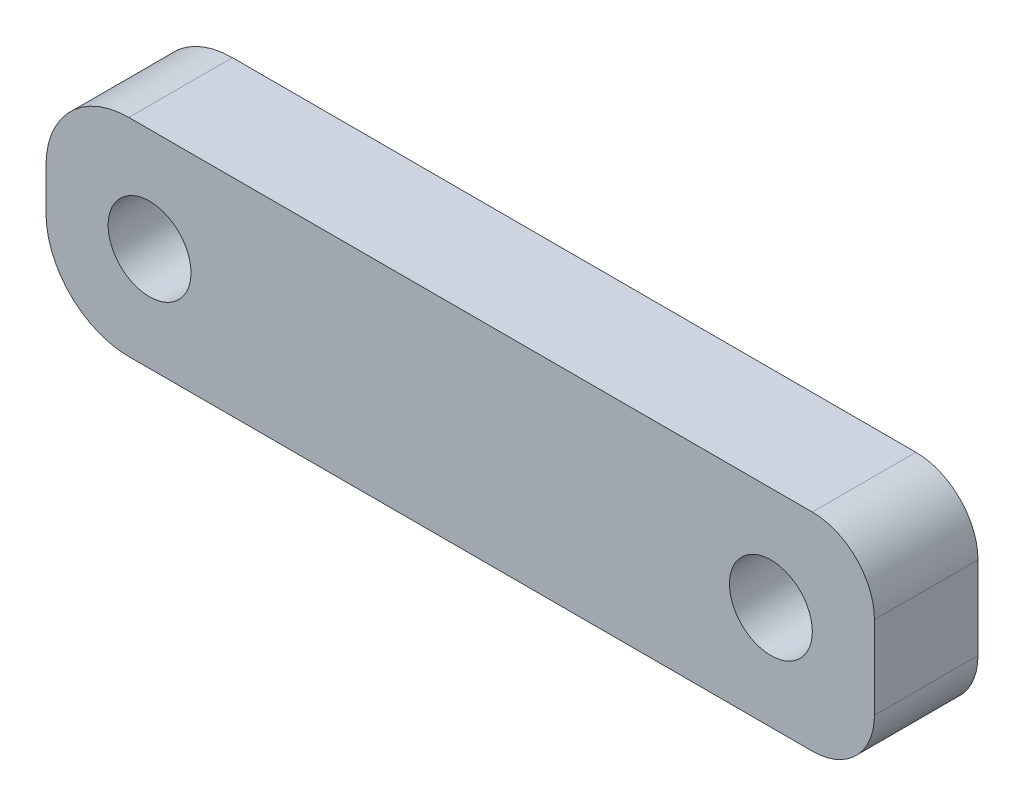
ISO-10303-21;
HEADER;
FILE_DESCRIPTION(('STEP AP214'),'2;1');
FILE_NAME('part.step','',(''),(''),'','','');
FILE_SCHEMA(('AUTOMOTIVE_DESIGN { 1 0 10303 214 1 1 1 1 }'));
ENDSEC;
DATA;
#1=APPLICATION_CONTEXT('core data for automotive mechanical design processes');
#2=APPLICATION_PROTOCOL_DEFINITION('international standard','automotive_design',2000,#1);
#3=PRODUCT_CONTEXT('',#1,'mechanical');
#4=PRODUCT('Part','Part','',(#3));
#5=PRODUCT_RELATED_PRODUCT_CATEGORY('part','',(#4));
#6=PRODUCT_DEFINITION_FORMATION('','',#4);
#7=PRODUCT_DEFINITION_CONTEXT('part definition',#1,'design');
#8=PRODUCT_DEFINITION('design','',#6,#7);
#9=PRODUCT_DEFINITION_SHAPE('','',#8);
#10=(LENGTH_UNIT() NAMED_UNIT(*) SI_UNIT(.MILLI.,.METRE.));
#11=(NAMED_UNIT(*) PLANE_ANGLE_UNIT() SI_UNIT($,.RADIAN.));
#12=(NAMED_UNIT(*) SI_UNIT($,.STERADIAN.) SOLID_ANGLE_UNIT());
#13=UNCERTAINTY_MEASURE_WITH_UNIT(LENGTH_MEASURE(1.E-05),#10,'distance_accuracy_value','');
#14=(GEOMETRIC_REPRESENTATION_CONTEXT(3) GLOBAL_UNCERTAINTY_ASSIGNED_CONTEXT((#13)) GLOBAL_UNIT_ASSIGNED_CONTEXT((#10,
#11,#12)) REPRESENTATION_CONTEXT('',''));
#15=CARTESIAN_POINT('',(0.,0.,0.));
#16=DIRECTION('',(0.,0.,1.));
#17=DIRECTION('',(1.,0.,0.));
#18=AXIS2_PLACEMENT_3D('',#15,#16,#17);
#19=CARTESIAN_POINT('',(37.,-7.,5.));
#20=DIRECTION('',(0.,0.,1.));
#21=DIRECTION('',(1.,0.,0.));
#22=AXIS2_PLACEMENT_3D('',#19,#20,#21);
#23=PLANE('',#22);
#24=CARTESIAN_POINT('',(35.,-5.,5.));
#25=DIRECTION('',(0.,0.,1.));
#26=DIRECTION('',(1.,0.,0.));
#27=AXIS2_PLACEMENT_3D('',#24,#25,#26);
#28=CIRCLE('',#27,2.);
#29=CARTESIAN_POINT('',(37.,-5.,5.));
#30=VERTEX_POINT('',#29);
#31=EDGE_CURVE('E142',#30,#30,#28,.T.);
#32=ORIENTED_EDGE('',*,*,#31,.F.);
#33=EDGE_LOOP('',(#32));
#34=FACE_BOUND('',#33,.T.);
#35=CARTESIAN_POINT('',(37.,-7.,5.));
#36=DIRECTION('',(0.,0.,1.));
#37=DIRECTION('',(1.,0.,0.));
#38=AXIS2_PLACEMENT_3D('',#35,#36,#37);
#39=CIRCLE('',#38,3.);
#40=CARTESIAN_POINT('',(37.,-10.,5.));
#41=VERTEX_POINT('',#40);
#42=CARTESIAN_POINT('',(40.,-6.99999999999998,5.));
#43=VERTEX_POINT('',#42);
#44=EDGE_CURVE('E153',#41,#43,#39,.T.);
#45=ORIENTED_EDGE('',*,*,#44,.T.);
#46=DIRECTION('',(0.,1.,0.));
#47=VECTOR('',#46,1.);
#48=CARTESIAN_POINT('',(40.,-3.00000000000002,5.));
#49=LINE('',#48,#47);
#50=CARTESIAN_POINT('',(40.,-3.00000000000002,5.));
#51=VERTEX_POINT('',#50);
#52=EDGE_CURVE('E101',#43,#51,#49,.T.);
#53=ORIENTED_EDGE('',*,*,#52,.T.);
#54=CARTESIAN_POINT('',(37.,-3.,5.));
#55=DIRECTION('',(0.,0.,1.));
#56=DIRECTION('',(-1.,0.,0.));
#57=AXIS2_PLACEMENT_3D('',#54,#55,#56);
#58=CIRCLE('',#57,3.);
#59=CARTESIAN_POINT('',(37.,0.,5.));
#60=VERTEX_POINT('',#59);
#61=EDGE_CURVE('E168',#51,#60,#58,.T.);
#62=ORIENTED_EDGE('',*,*,#61,.T.);
#63=DIRECTION('',(-1.,0.,0.));
#64=VECTOR('',#63,1.);
#65=CARTESIAN_POINT('',(4.00000000000003,0.,5.));
#66=LINE('',#65,#64);
#67=CARTESIAN_POINT('',(4.00000000000003,0.,5.));
#68=VERTEX_POINT('',#67);
#69=EDGE_CURVE('E181',#60,#68,#66,.T.);
#70=ORIENTED_EDGE('',*,*,#69,.T.);
#71=CARTESIAN_POINT('',(4.,-4.,5.));
#72=DIRECTION('',(0.,0.,1.));
#73=DIRECTION('',(1.,0.,0.));
#74=AXIS2_PLACEMENT_3D('',#71,#72,#73);
#75=CIRCLE('',#74,4.);
#76=CARTESIAN_POINT('',(0.,-4.00000000000003,5.));
#77=VERTEX_POINT('',#76);
#78=EDGE_CURVE('E120',#68,#77,#75,.T.);
#79=ORIENTED_EDGE('',*,*,#78,.T.);
#80=DIRECTION('',(0.,-1.,0.));
#81=VECTOR('',#80,1.);
#82=CARTESIAN_POINT('',(0.,-4.00000000000003,5.));
#83=LINE('',#82,#81);
#84=CARTESIAN_POINT('',(0.,-5.99999999999997,5.));
#85=VERTEX_POINT('',#84);
#86=EDGE_CURVE('E114',#77,#85,#83,.T.);
#87=ORIENTED_EDGE('',*,*,#86,.T.);
#88=CARTESIAN_POINT('',(4.,-6.,5.));
#89=DIRECTION('',(0.,0.,1.));
#90=DIRECTION('',(1.,0.,0.));
#91=AXIS2_PLACEMENT_3D('',#88,#89,#90);
#92=CIRCLE('',#91,4.);
#93=CARTESIAN_POINT('',(4.00000000000003,-10.,5.));
#94=VERTEX_POINT('',#93);
#95=EDGE_CURVE('E118',#85,#94,#92,.T.);
#96=ORIENTED_EDGE('',*,*,#95,.T.);
#97=DIRECTION('',(1.,0.,0.));
#98=VECTOR('',#97,1.);
#99=CARTESIAN_POINT('',(4.00000000000003,-10.,5.));
#100=LINE('',#99,#98);
#101=EDGE_CURVE('E58',#94,#41,#100,.T.);
#102=ORIENTED_EDGE('',*,*,#101,.T.);
#103=EDGE_LOOP('',(#45,#53,#62,#70,#79,#87,#96,#102));
#104=FACE_BOUND('',#103,.T.);
#105=CARTESIAN_POINT('',(5.,-5.,5.));
#106=DIRECTION('',(0.,0.,1.));
#107=DIRECTION('',(1.,0.,0.));
#108=AXIS2_PLACEMENT_3D('',#105,#106,#107);
#109=CIRCLE('',#108,2.);
#110=CARTESIAN_POINT('',(7.,-5.,5.));
#111=VERTEX_POINT('',#110);
#112=EDGE_CURVE('E190',#111,#111,#109,.T.);
#113=ORIENTED_EDGE('',*,*,#112,.F.);
#114=EDGE_LOOP('',(#113));
#115=FACE_BOUND('',#114,.T.);
#116=ADVANCED_FACE('F41',(#34,#104,#115),#23,.T.);
#117=CARTESIAN_POINT('',(37.,-7.,0.));
#118=DIRECTION('',(0.,0.,1.));
#119=DIRECTION('',(1.,0.,0.));
#120=AXIS2_PLACEMENT_3D('',#117,#118,#119);
#121=PLANE('',#120);
#122=CARTESIAN_POINT('',(37.,-7.,0.));
#123=DIRECTION('',(0.,0.,1.));
#124=DIRECTION('',(1.,0.,0.));
#125=AXIS2_PLACEMENT_3D('',#122,#123,#124);
#126=CIRCLE('',#125,3.);
#127=CARTESIAN_POINT('',(37.,-10.,0.));
#128=VERTEX_POINT('',#127);
#129=CARTESIAN_POINT('',(40.,-6.99999999999998,0.));
#130=VERTEX_POINT('',#129);
#131=EDGE_CURVE('E138',#128,#130,#126,.T.);
#132=ORIENTED_EDGE('',*,*,#131,.F.);
#133=DIRECTION('',(1.,0.,0.));
#134=VECTOR('',#133,1.);
#135=CARTESIAN_POINT('',(4.00000000000003,-10.,0.));
#136=LINE('',#135,#134);
#137=CARTESIAN_POINT('',(4.00000000000003,-10.,0.));
#138=VERTEX_POINT('',#137);
#139=EDGE_CURVE('E93',#138,#128,#136,.T.);
#140=ORIENTED_EDGE('',*,*,#139,.F.);
#141=CARTESIAN_POINT('',(4.,-6.,0.));
#142=DIRECTION('',(0.,0.,1.));
#143=DIRECTION('',(1.,0.,0.));
#144=AXIS2_PLACEMENT_3D('',#141,#142,#143);
#145=CIRCLE('',#144,4.);
#146=CARTESIAN_POINT('',(0.,-5.99999999999997,0.));
#147=VERTEX_POINT('',#146);
#148=EDGE_CURVE('E87',#147,#138,#145,.T.);
#149=ORIENTED_EDGE('',*,*,#148,.F.);
#150=DIRECTION('',(0.,-1.,0.));
#151=VECTOR('',#150,1.);
#152=CARTESIAN_POINT('',(0.,-4.00000000000003,0.));
#153=LINE('',#152,#151);
#154=CARTESIAN_POINT('',(0.,-4.00000000000003,0.));
#155=VERTEX_POINT('',#154);
#156=EDGE_CURVE('E128',#155,#147,#153,.T.);
#157=ORIENTED_EDGE('',*,*,#156,.F.);
#158=CARTESIAN_POINT('',(4.,-4.,0.));
#159=DIRECTION('',(0.,0.,1.));
#160=DIRECTION('',(1.,0.,0.));
#161=AXIS2_PLACEMENT_3D('',#158,#159,#160);
#162=CIRCLE('',#161,4.);
#163=CARTESIAN_POINT('',(4.00000000000003,0.,0.));
#164=VERTEX_POINT('',#163);
#165=EDGE_CURVE('E148',#164,#155,#162,.T.);
#166=ORIENTED_EDGE('',*,*,#165,.F.);
#167=DIRECTION('',(-1.,0.,0.));
#168=VECTOR('',#167,1.);
#169=CARTESIAN_POINT('',(4.00000000000003,0.,0.));
#170=LINE('',#169,#168);
#171=CARTESIAN_POINT('',(37.,0.,0.));
#172=VERTEX_POINT('',#171);
#173=EDGE_CURVE('E146',#172,#164,#170,.T.);
#174=ORIENTED_EDGE('',*,*,#173,.F.);
#175=CARTESIAN_POINT('',(37.,-3.,0.));
#176=DIRECTION('',(0.,0.,1.));
#177=DIRECTION('',(-1.,0.,0.));
#178=AXIS2_PLACEMENT_3D('',#175,#176,#177);
#179=CIRCLE('',#178,3.);
#180=CARTESIAN_POINT('',(40.,-3.00000000000002,0.));
#181=VERTEX_POINT('',#180);
#182=EDGE_CURVE('E144',#181,#172,#179,.T.);
#183=ORIENTED_EDGE('',*,*,#182,.F.);
#184=DIRECTION('',(0.,1.,0.));
#185=VECTOR('',#184,1.);
#186=CARTESIAN_POINT('',(40.,-3.00000000000002,0.));
#187=LINE('',#186,#185);
#188=EDGE_CURVE('E141',#130,#181,#187,.T.);
#189=ORIENTED_EDGE('',*,*,#188,.F.);
#190=EDGE_LOOP('',(#132,#140,#149,#157,#166,#174,#183,#189));
#191=FACE_BOUND('',#190,.T.);
#192=CARTESIAN_POINT('',(35.,-5.,0.));
#193=DIRECTION('',(0.,0.,1.));
#194=DIRECTION('',(1.,0.,0.));
#195=AXIS2_PLACEMENT_3D('',#192,#193,#194);
#196=CIRCLE('',#195,2.);
#197=CARTESIAN_POINT('',(37.,-5.,0.));
#198=VERTEX_POINT('',#197);
#199=EDGE_CURVE('E187',#198,#198,#196,.T.);
#200=ORIENTED_EDGE('',*,*,#199,.T.);
#201=EDGE_LOOP('',(#200));
#202=FACE_BOUND('',#201,.T.);
#203=CARTESIAN_POINT('',(5.,-5.,0.));
#204=DIRECTION('',(0.,0.,1.));
#205=DIRECTION('',(1.,0.,0.));
#206=AXIS2_PLACEMENT_3D('',#203,#204,#205);
#207=CIRCLE('',#206,2.);
#208=CARTESIAN_POINT('',(7.,-5.,0.));
#209=VERTEX_POINT('',#208);
#210=EDGE_CURVE('E193',#209,#209,#207,.T.);
#211=ORIENTED_EDGE('',*,*,#210,.T.);
#212=EDGE_LOOP('',(#211));
#213=FACE_BOUND('',#212,.T.);
#214=ADVANCED_FACE('F172',(#191,#202,#213),#121,.F.);
#215=CARTESIAN_POINT('',(37.,-7.,5.));
#216=DIRECTION('',(0.,0.,-1.));
#217=DIRECTION('',(-1.,0.,0.));
#218=AXIS2_PLACEMENT_3D('',#215,#216,#217);
#219=CYLINDRICAL_SURFACE('',#218,3.);
#220=ORIENTED_EDGE('',*,*,#131,.T.);
#221=DIRECTION('',(0.,0.,-1.));
#222=VECTOR('',#221,1.);
#223=CARTESIAN_POINT('',(40.,-6.99999999999998,5.));
#224=LINE('',#223,#222);
#225=EDGE_CURVE('E11',#43,#130,#224,.T.);
#226=ORIENTED_EDGE('',*,*,#225,.F.);
#227=ORIENTED_EDGE('',*,*,#44,.F.);
#228=DIRECTION('',(0.,0.,-1.));
#229=VECTOR('',#228,1.);
#230=CARTESIAN_POINT('',(37.,-10.,5.));
#231=LINE('',#230,#229);
#232=EDGE_CURVE('E134',#41,#128,#231,.T.);
#233=ORIENTED_EDGE('',*,*,#232,.T.);
#234=EDGE_LOOP('',(#220,#226,#227,#233));
#235=FACE_BOUND('',#234,.T.);
#236=ADVANCED_FACE('F43',(#235),#219,.T.);
#237=CARTESIAN_POINT('',(40.,-3.00000000000002,5.));
#238=DIRECTION('',(-1.,0.,0.));
#239=DIRECTION('',(0.,0.,1.));
#240=AXIS2_PLACEMENT_3D('',#237,#238,#239);
#241=PLANE('',#240);
#242=ORIENTED_EDGE('',*,*,#188,.T.);
#243=DIRECTION('',(0.,0.,-1.));
#244=VECTOR('',#243,1.);
#245=CARTESIAN_POINT('',(40.,-3.00000000000002,5.));
#246=LINE('',#245,#244);
#247=EDGE_CURVE('E50',#51,#181,#246,.T.);
#248=ORIENTED_EDGE('',*,*,#247,.F.);
#249=ORIENTED_EDGE('',*,*,#52,.F.);
#250=ORIENTED_EDGE('',*,*,#225,.T.);
#251=EDGE_LOOP('',(#242,#248,#249,#250));
#252=FACE_BOUND('',#251,.T.);
#253=ADVANCED_FACE('F225',(#252),#241,.F.);
#254=CARTESIAN_POINT('',(37.,-3.,5.));
#255=DIRECTION('',(0.,0.,-1.));
#256=DIRECTION('',(-1.,0.,0.));
#257=AXIS2_PLACEMENT_3D('',#254,#255,#256);
#258=CYLINDRICAL_SURFACE('',#257,3.);
#259=ORIENTED_EDGE('',*,*,#182,.T.);
#260=DIRECTION('',(0.,0.,-1.));
#261=VECTOR('',#260,1.);
#262=CARTESIAN_POINT('',(37.,0.,5.));
#263=LINE('',#262,#261);
#264=EDGE_CURVE('E160',#60,#172,#263,.T.);
#265=ORIENTED_EDGE('',*,*,#264,.F.);
#266=ORIENTED_EDGE('',*,*,#61,.F.);
#267=ORIENTED_EDGE('',*,*,#247,.T.);
#268=EDGE_LOOP('',(#259,#265,#266,#267));
#269=FACE_BOUND('',#268,.T.);
#270=ADVANCED_FACE('F166',(#269),#258,.T.);
#271=CARTESIAN_POINT('',(4.00000000000003,0.,5.));
#272=DIRECTION('',(0.,-1.,0.));
#273=DIRECTION('',(0.,0.,-1.));
#274=AXIS2_PLACEMENT_3D('',#271,#272,#273);
#275=PLANE('',#274);
#276=ORIENTED_EDGE('',*,*,#173,.T.);
#277=DIRECTION('',(0.,0.,-1.));
#278=VECTOR('',#277,1.);
#279=CARTESIAN_POINT('',(4.00000000000003,0.,5.));
#280=LINE('',#279,#278);
#281=EDGE_CURVE('E157',#68,#164,#280,.T.);
#282=ORIENTED_EDGE('',*,*,#281,.F.);
#283=ORIENTED_EDGE('',*,*,#69,.F.);
#284=ORIENTED_EDGE('',*,*,#264,.T.);
#285=EDGE_LOOP('',(#276,#282,#283,#284));
#286=FACE_BOUND('',#285,.T.);
#287=ADVANCED_FACE('F177',(#286),#275,.F.);
#288=CARTESIAN_POINT('',(4.,-4.,5.));
#289=DIRECTION('',(0.,0.,-1.));
#290=DIRECTION('',(-1.,0.,0.));
#291=AXIS2_PLACEMENT_3D('',#288,#289,#290);
#292=CYLINDRICAL_SURFACE('',#291,4.);
#293=ORIENTED_EDGE('',*,*,#165,.T.);
#294=DIRECTION('',(0.,0.,-1.));
#295=VECTOR('',#294,1.);
#296=CARTESIAN_POINT('',(0.,-4.00000000000003,5.));
#297=LINE('',#296,#295);
#298=EDGE_CURVE('E129',#77,#155,#297,.T.);
#299=ORIENTED_EDGE('',*,*,#298,.F.);
#300=ORIENTED_EDGE('',*,*,#78,.F.);
#301=ORIENTED_EDGE('',*,*,#281,.T.);
#302=EDGE_LOOP('',(#293,#299,#300,#301));
#303=FACE_BOUND('',#302,.T.);
#304=ADVANCED_FACE('F180',(#303),#292,.T.);
#305=CARTESIAN_POINT('',(0.,-4.00000000000003,5.));
#306=DIRECTION('',(1.,0.,0.));
#307=DIRECTION('',(0.,1.,0.));
#308=AXIS2_PLACEMENT_3D('',#305,#306,#307);
#309=PLANE('',#308);
#310=ORIENTED_EDGE('',*,*,#156,.T.);
#311=DIRECTION('',(0.,0.,-1.));
#312=VECTOR('',#311,1.);
#313=CARTESIAN_POINT('',(0.,-5.99999999999997,5.));
#314=LINE('',#313,#312);
#315=EDGE_CURVE('E125',#85,#147,#314,.T.);
#316=ORIENTED_EDGE('',*,*,#315,.F.);
#317=ORIENTED_EDGE('',*,*,#86,.F.);
#318=ORIENTED_EDGE('',*,*,#298,.T.);
#319=EDGE_LOOP('',(#310,#316,#317,#318));
#320=FACE_BOUND('',#319,.T.);
#321=ADVANCED_FACE('F126',(#320),#309,.F.);
#322=CARTESIAN_POINT('',(4.,-6.,5.));
#323=DIRECTION('',(0.,0.,-1.));
#324=DIRECTION('',(-1.,0.,0.));
#325=AXIS2_PLACEMENT_3D('',#322,#323,#324);
#326=CYLINDRICAL_SURFACE('',#325,4.);
#327=ORIENTED_EDGE('',*,*,#148,.T.);
#328=DIRECTION('',(0.,0.,-1.));
#329=VECTOR('',#328,1.);
#330=CARTESIAN_POINT('',(4.00000000000003,-10.,5.));
#331=LINE('',#330,#329);
#332=EDGE_CURVE('E130',#94,#138,#331,.T.);
#333=ORIENTED_EDGE('',*,*,#332,.F.);
#334=ORIENTED_EDGE('',*,*,#95,.F.);
#335=ORIENTED_EDGE('',*,*,#315,.T.);
#336=EDGE_LOOP('',(#327,#333,#334,#335));
#337=FACE_BOUND('',#336,.T.);
#338=ADVANCED_FACE('F132',(#337),#326,.T.);
#339=CARTESIAN_POINT('',(4.00000000000003,-10.,5.));
#340=DIRECTION('',(0.,1.,0.));
#341=DIRECTION('',(0.,0.,1.));
#342=AXIS2_PLACEMENT_3D('',#339,#340,#341);
#343=PLANE('',#342);
#344=ORIENTED_EDGE('',*,*,#139,.T.);
#345=ORIENTED_EDGE('',*,*,#232,.F.);
#346=ORIENTED_EDGE('',*,*,#101,.F.);
#347=ORIENTED_EDGE('',*,*,#332,.T.);
#348=EDGE_LOOP('',(#344,#345,#346,#347));
#349=FACE_BOUND('',#348,.T.);
#350=ADVANCED_FACE('F213',(#349),#343,.F.);
#351=CARTESIAN_POINT('',(35.,-5.,5.));
#352=DIRECTION('',(0.,0.,-1.));
#353=DIRECTION('',(-1.,0.,0.));
#354=AXIS2_PLACEMENT_3D('',#351,#352,#353);
#355=CYLINDRICAL_SURFACE('',#354,2.);
#356=ORIENTED_EDGE('',*,*,#31,.T.);
#357=EDGE_LOOP('',(#356));
#358=FACE_BOUND('',#357,.T.);
#359=ORIENTED_EDGE('',*,*,#199,.F.);
#360=EDGE_LOOP('',(#359));
#361=FACE_BOUND('',#360,.T.);
#362=ADVANCED_FACE('F210',(#358,#361),#355,.F.);
#363=CARTESIAN_POINT('',(5.,-5.,5.));
#364=DIRECTION('',(0.,0.,-1.));
#365=DIRECTION('',(-1.,0.,0.));
#366=AXIS2_PLACEMENT_3D('',#363,#364,#365);
#367=CYLINDRICAL_SURFACE('',#366,2.);
#368=ORIENTED_EDGE('',*,*,#112,.T.);
#369=EDGE_LOOP('',(#368));
#370=FACE_BOUND('',#369,.T.);
#371=ORIENTED_EDGE('',*,*,#210,.F.);
#372=EDGE_LOOP('',(#371));
#373=FACE_BOUND('',#372,.T.);
#374=ADVANCED_FACE('F199',(#370,#373),#367,.F.);
#375=CLOSED_SHELL('',(#116,#214,#236,#253,#270,#287,#304,#321,#338,#350,#362,#374));
#376=MANIFOLD_SOLID_BREP('B2',#375);
#377=ADVANCED_BREP_SHAPE_REPRESENTATION('',(#18,#376),#14);
#378=SHAPE_DEFINITION_REPRESENTATION(#9,#377);
ENDSEC;
END-ISO-10303-21;
